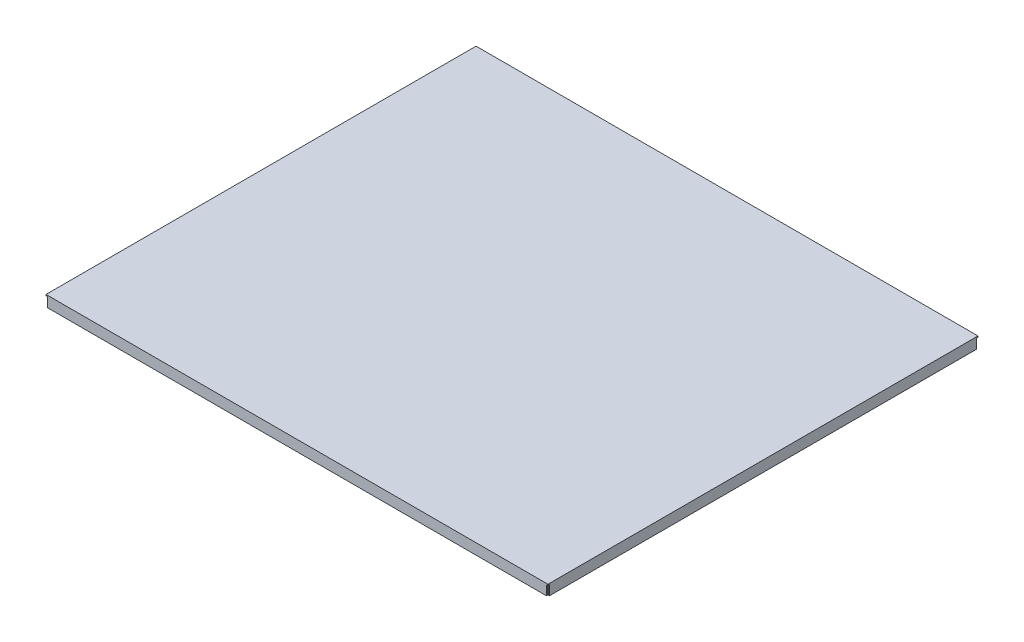
ISO-10303-21;
HEADER;
FILE_DESCRIPTION(('STEP AP214'),'2;1');
FILE_NAME('part.step','',(''),(''),'','','');
FILE_SCHEMA(('AUTOMOTIVE_DESIGN { 1 0 10303 214 1 1 1 1 }'));
ENDSEC;
DATA;
#1=APPLICATION_CONTEXT('core data for automotive mechanical design processes');
#2=APPLICATION_PROTOCOL_DEFINITION('international standard','automotive_design',2000,#1);
#3=PRODUCT_CONTEXT('',#1,'mechanical');
#4=PRODUCT('Part','Part','',(#3));
#5=PRODUCT_RELATED_PRODUCT_CATEGORY('part','',(#4));
#6=PRODUCT_DEFINITION_FORMATION('','',#4);
#7=PRODUCT_DEFINITION_CONTEXT('part definition',#1,'design');
#8=PRODUCT_DEFINITION('design','',#6,#7);
#9=PRODUCT_DEFINITION_SHAPE('','',#8);
#10=(LENGTH_UNIT() NAMED_UNIT(*) SI_UNIT(.MILLI.,.METRE.));
#11=(NAMED_UNIT(*) PLANE_ANGLE_UNIT() SI_UNIT($,.RADIAN.));
#12=(NAMED_UNIT(*) SI_UNIT($,.STERADIAN.) SOLID_ANGLE_UNIT());
#13=UNCERTAINTY_MEASURE_WITH_UNIT(LENGTH_MEASURE(1.E-05),#10,'distance_accuracy_value','');
#14=(GEOMETRIC_REPRESENTATION_CONTEXT(3) GLOBAL_UNCERTAINTY_ASSIGNED_CONTEXT((#13)) GLOBAL_UNIT_ASSIGNED_CONTEXT((#10,
#11,#12)) REPRESENTATION_CONTEXT('',''));
#15=CARTESIAN_POINT('',(0.,0.,0.));
#16=DIRECTION('',(0.,0.,1.));
#17=DIRECTION('',(1.,0.,0.));
#18=AXIS2_PLACEMENT_3D('',#15,#16,#17);
#19=CARTESIAN_POINT('',(0.,485.,0.));
#20=DIRECTION('',(0.,-1.,0.));
#21=DIRECTION('',(0.,0.,-1.));
#22=AXIS2_PLACEMENT_3D('',#19,#20,#21);
#23=PLANE('',#22);
#24=DIRECTION('',(-1.,0.,0.));
#25=VECTOR('',#24,1.);
#26=CARTESIAN_POINT('',(-349.,485.,53.));
#27=LINE('',#26,#25);
#28=CARTESIAN_POINT('',(-347.5,485.,53.));
#29=VERTEX_POINT('',#28);
#30=CARTESIAN_POINT('',(-349.,485.,53.));
#31=VERTEX_POINT('',#30);
#32=EDGE_CURVE('E167',#29,#31,#27,.T.);
#33=ORIENTED_EDGE('',*,*,#32,.F.);
#34=DIRECTION('',(0.,0.,-1.));
#35=VECTOR('',#34,1.);
#36=CARTESIAN_POINT('',(-347.5,485.,647.5));
#37=LINE('',#36,#35);
#38=CARTESIAN_POINT('',(-347.5,485.,647.));
#39=VERTEX_POINT('',#38);
#40=EDGE_CURVE('E271',#39,#29,#37,.T.);
#41=ORIENTED_EDGE('',*,*,#40,.F.);
#42=DIRECTION('',(1.,0.,0.));
#43=VECTOR('',#42,1.);
#44=CARTESIAN_POINT('',(-349.000000000001,485.,647.));
#45=LINE('',#44,#43);
#46=CARTESIAN_POINT('',(-349.000000000001,485.,647.));
#47=VERTEX_POINT('',#46);
#48=EDGE_CURVE('E244',#47,#39,#45,.T.);
#49=ORIENTED_EDGE('',*,*,#48,.F.);
#50=DIRECTION('',(0.,0.,1.));
#51=VECTOR('',#50,1.);
#52=CARTESIAN_POINT('',(-349.,485.,649.));
#53=LINE('',#52,#51);
#54=EDGE_CURVE('E203',#31,#47,#53,.T.);
#55=ORIENTED_EDGE('',*,*,#54,.F.);
#56=EDGE_LOOP('',(#33,#41,#49,#55));
#57=FACE_BOUND('',#56,.T.);
#58=ADVANCED_FACE('F17',(#57),#23,.T.);
#59=DIRECTION('',(1.,0.,0.));
#60=VECTOR('',#59,1.);
#61=CARTESIAN_POINT('',(349.,485.,647.000000000001));
#62=LINE('',#61,#60);
#63=CARTESIAN_POINT('',(347.500000000001,485.,647.000000000001));
#64=VERTEX_POINT('',#63);
#65=CARTESIAN_POINT('',(349.,485.,647.000000000001));
#66=VERTEX_POINT('',#65);
#67=EDGE_CURVE('E287',#64,#66,#62,.T.);
#68=ORIENTED_EDGE('',*,*,#67,.F.);
#69=DIRECTION('',(0.,0.,1.));
#70=VECTOR('',#69,1.);
#71=CARTESIAN_POINT('',(347.5,485.,52.5));
#72=LINE('',#71,#70);
#73=CARTESIAN_POINT('',(347.5,485.,52.9999999999999));
#74=VERTEX_POINT('',#73);
#75=EDGE_CURVE('E264',#74,#64,#72,.T.);
#76=ORIENTED_EDGE('',*,*,#75,.F.);
#77=DIRECTION('',(-1.,0.,0.));
#78=VECTOR('',#77,1.);
#79=CARTESIAN_POINT('',(349.,485.,52.9999999999999));
#80=LINE('',#79,#78);
#81=CARTESIAN_POINT('',(349.,485.,52.9999999999999));
#82=VERTEX_POINT('',#81);
#83=EDGE_CURVE('E307',#82,#74,#80,.T.);
#84=ORIENTED_EDGE('',*,*,#83,.F.);
#85=DIRECTION('',(0.,0.,-1.));
#86=VECTOR('',#85,1.);
#87=CARTESIAN_POINT('',(349.000000000001,485.,649.));
#88=LINE('',#87,#86);
#89=EDGE_CURVE('E184',#66,#82,#88,.T.);
#90=ORIENTED_EDGE('',*,*,#89,.F.);
#91=EDGE_LOOP('',(#68,#76,#84,#90));
#92=FACE_BOUND('',#91,.T.);
#93=ADVANCED_FACE('F357',(#92),#23,.T.);
#94=DIRECTION('',(-1.11022302462509E-13,0.,1.));
#95=VECTOR('',#94,1.);
#96=CARTESIAN_POINT('',(-347.,485.,50.9999999999999));
#97=LINE('',#96,#95);
#98=CARTESIAN_POINT('',(-347.,485.,50.9999999999999));
#99=VERTEX_POINT('',#98);
#100=CARTESIAN_POINT('',(-347.,485.,52.5000000000001));
#101=VERTEX_POINT('',#100);
#102=EDGE_CURVE('E160',#99,#101,#97,.T.);
#103=ORIENTED_EDGE('',*,*,#102,.F.);
#104=DIRECTION('',(-1.,0.,0.));
#105=VECTOR('',#104,1.);
#106=CARTESIAN_POINT('',(-349.,485.,51.));
#107=LINE('',#106,#105);
#108=CARTESIAN_POINT('',(347.,485.,50.9999999999998));
#109=VERTEX_POINT('',#108);
#110=EDGE_CURVE('E174',#109,#99,#107,.T.);
#111=ORIENTED_EDGE('',*,*,#110,.F.);
#112=DIRECTION('',(-1.11022302462509E-13,0.,-1.));
#113=VECTOR('',#112,1.);
#114=CARTESIAN_POINT('',(347.,485.,50.9999999999998));
#115=LINE('',#114,#113);
#116=CARTESIAN_POINT('',(347.,485.,52.5));
#117=VERTEX_POINT('',#116);
#118=EDGE_CURVE('E309',#117,#109,#115,.T.);
#119=ORIENTED_EDGE('',*,*,#118,.F.);
#120=DIRECTION('',(1.,0.,0.));
#121=VECTOR('',#120,1.);
#122=CARTESIAN_POINT('',(-347.5,485.,52.5000000000001));
#123=LINE('',#122,#121);
#124=EDGE_CURVE('E176',#101,#117,#123,.T.);
#125=ORIENTED_EDGE('',*,*,#124,.F.);
#126=EDGE_LOOP('',(#103,#111,#119,#125));
#127=FACE_BOUND('',#126,.T.);
#128=ADVANCED_FACE('F172',(#127),#23,.T.);
#129=CARTESIAN_POINT('',(-349.,485.,649.));
#130=DIRECTION('',(-1.,0.,0.));
#131=DIRECTION('',(0.,0.,1.));
#132=AXIS2_PLACEMENT_3D('',#129,#130,#131);
#133=PLANE('',#132);
#134=DIRECTION('',(0.,-1.,0.));
#135=VECTOR('',#134,1.);
#136=CARTESIAN_POINT('',(-349.,501.328427124747,53.));
#137=LINE('',#136,#135);
#138=CARTESIAN_POINT('',(-349.,498.5,53.));
#139=VERTEX_POINT('',#138);
#140=EDGE_CURVE('E166',#139,#31,#137,.T.);
#141=ORIENTED_EDGE('',*,*,#140,.T.);
#142=ORIENTED_EDGE('',*,*,#54,.T.);
#143=DIRECTION('',(0.,-1.,0.));
#144=VECTOR('',#143,1.);
#145=CARTESIAN_POINT('',(-349.000000000001,501.328427124747,647.));
#146=LINE('',#145,#144);
#147=CARTESIAN_POINT('',(-349.000000000001,498.5,647.));
#148=VERTEX_POINT('',#147);
#149=EDGE_CURVE('E249',#148,#47,#146,.T.);
#150=ORIENTED_EDGE('',*,*,#149,.F.);
#151=DIRECTION('',(2.22044604925043E-13,0.,1.));
#152=VECTOR('',#151,1.);
#153=CARTESIAN_POINT('',(-349.,498.5,649.));
#154=LINE('',#153,#152);
#155=CARTESIAN_POINT('',(-349.,498.5,649.));
#156=VERTEX_POINT('',#155);
#157=EDGE_CURVE('E228',#148,#156,#154,.T.);
#158=ORIENTED_EDGE('',*,*,#157,.T.);
#159=DIRECTION('',(0.,1.,0.));
#160=VECTOR('',#159,1.);
#161=CARTESIAN_POINT('',(-349.,485.,649.));
#162=LINE('',#161,#160);
#163=CARTESIAN_POINT('',(-349.,500.,649.));
#164=VERTEX_POINT('',#163);
#165=EDGE_CURVE('E21',#156,#164,#162,.T.);
#166=ORIENTED_EDGE('',*,*,#165,.T.);
#167=DIRECTION('',(0.,0.,1.));
#168=VECTOR('',#167,1.);
#169=CARTESIAN_POINT('',(-349.,500.,649.));
#170=LINE('',#169,#168);
#171=CARTESIAN_POINT('',(-349.,500.,51.));
#172=VERTEX_POINT('',#171);
#173=EDGE_CURVE('E192',#172,#164,#170,.T.);
#174=ORIENTED_EDGE('',*,*,#173,.F.);
#175=DIRECTION('',(0.,1.,0.));
#176=VECTOR('',#175,1.);
#177=CARTESIAN_POINT('',(-349.,485.,51.));
#178=LINE('',#177,#176);
#179=CARTESIAN_POINT('',(-349.,498.5,51.0000000000001));
#180=VERTEX_POINT('',#179);
#181=EDGE_CURVE('E11',#180,#172,#178,.T.);
#182=ORIENTED_EDGE('',*,*,#181,.F.);
#183=DIRECTION('',(0.,0.,1.));
#184=VECTOR('',#183,1.);
#185=CARTESIAN_POINT('',(-349.,498.5,51.0000000000001));
#186=LINE('',#185,#184);
#187=EDGE_CURVE('E345',#180,#139,#186,.T.);
#188=ORIENTED_EDGE('',*,*,#187,.T.);
#189=EDGE_LOOP('',(#141,#142,#150,#158,#166,#174,#182,#188));
#190=FACE_BOUND('',#189,.T.);
#191=ADVANCED_FACE('F19',(#190),#133,.T.);
#192=CARTESIAN_POINT('',(-349.,485.,51.));
#193=DIRECTION('',(0.,0.,-1.));
#194=DIRECTION('',(-1.,0.,0.));
#195=AXIS2_PLACEMENT_3D('',#192,#193,#194);
#196=PLANE('',#195);
#197=DIRECTION('',(0.,-1.,0.));
#198=VECTOR('',#197,1.);
#199=CARTESIAN_POINT('',(-347.,501.328427124747,50.9999999999999));
#200=LINE('',#199,#198);
#201=CARTESIAN_POINT('',(-347.,498.5,50.9999999999999));
#202=VERTEX_POINT('',#201);
#203=EDGE_CURVE('E157',#202,#99,#200,.T.);
#204=ORIENTED_EDGE('',*,*,#203,.F.);
#205=DIRECTION('',(-1.,0.,0.));
#206=VECTOR('',#205,1.);
#207=CARTESIAN_POINT('',(-349.,498.5,51.0000000000001));
#208=LINE('',#207,#206);
#209=EDGE_CURVE('E318',#202,#180,#208,.T.);
#210=ORIENTED_EDGE('',*,*,#209,.T.);
#211=ORIENTED_EDGE('',*,*,#181,.T.);
#212=DIRECTION('',(-1.,0.,0.));
#213=VECTOR('',#212,1.);
#214=CARTESIAN_POINT('',(-349.,500.,51.));
#215=LINE('',#214,#213);
#216=CARTESIAN_POINT('',(349.,500.,50.9999999999999));
#217=VERTEX_POINT('',#216);
#218=EDGE_CURVE('E201',#217,#172,#215,.T.);
#219=ORIENTED_EDGE('',*,*,#218,.F.);
#220=DIRECTION('',(0.,1.,0.));
#221=VECTOR('',#220,1.);
#222=CARTESIAN_POINT('',(349.,485.,50.9999999999999));
#223=LINE('',#222,#221);
#224=CARTESIAN_POINT('',(349.,498.5,50.9999999999999));
#225=VERTEX_POINT('',#224);
#226=EDGE_CURVE('E26',#225,#217,#223,.T.);
#227=ORIENTED_EDGE('',*,*,#226,.F.);
#228=DIRECTION('',(-1.,0.,0.));
#229=VECTOR('',#228,1.);
#230=CARTESIAN_POINT('',(349.,498.5,50.9999999999999));
#231=LINE('',#230,#229);
#232=CARTESIAN_POINT('',(347.,498.5,50.9999999999998));
#233=VERTEX_POINT('',#232);
#234=EDGE_CURVE('E304',#225,#233,#231,.T.);
#235=ORIENTED_EDGE('',*,*,#234,.T.);
#236=DIRECTION('',(0.,-1.,0.));
#237=VECTOR('',#236,1.);
#238=CARTESIAN_POINT('',(347.,501.328427124747,50.9999999999998));
#239=LINE('',#238,#237);
#240=EDGE_CURVE('E183',#233,#109,#239,.T.);
#241=ORIENTED_EDGE('',*,*,#240,.T.);
#242=ORIENTED_EDGE('',*,*,#110,.T.);
#243=EDGE_LOOP('',(#204,#210,#211,#219,#227,#235,#241,#242));
#244=FACE_BOUND('',#243,.T.);
#245=ADVANCED_FACE('F180',(#244),#196,.T.);
#246=CARTESIAN_POINT('',(349.000000000001,485.,649.));
#247=DIRECTION('',(1.,0.,0.));
#248=DIRECTION('',(0.,0.,-1.));
#249=AXIS2_PLACEMENT_3D('',#246,#247,#248);
#250=PLANE('',#249);
#251=DIRECTION('',(0.,-1.,0.));
#252=VECTOR('',#251,1.);
#253=CARTESIAN_POINT('',(349.,501.328427124747,647.000000000001));
#254=LINE('',#253,#252);
#255=CARTESIAN_POINT('',(349.,498.5,647.000000000001));
#256=VERTEX_POINT('',#255);
#257=EDGE_CURVE('E297',#256,#66,#254,.T.);
#258=ORIENTED_EDGE('',*,*,#257,.T.);
#259=ORIENTED_EDGE('',*,*,#89,.T.);
#260=DIRECTION('',(0.,-1.,0.));
#261=VECTOR('',#260,1.);
#262=CARTESIAN_POINT('',(349.,501.328427124747,52.9999999999999));
#263=LINE('',#262,#261);
#264=CARTESIAN_POINT('',(349.,498.5,52.9999999999999));
#265=VERTEX_POINT('',#264);
#266=EDGE_CURVE('E311',#265,#82,#263,.T.);
#267=ORIENTED_EDGE('',*,*,#266,.F.);
#268=DIRECTION('',(1.11022302462516E-13,0.,-1.));
#269=VECTOR('',#268,1.);
#270=CARTESIAN_POINT('',(349.,498.5,50.9999999999999));
#271=LINE('',#270,#269);
#272=EDGE_CURVE('E291',#265,#225,#271,.T.);
#273=ORIENTED_EDGE('',*,*,#272,.T.);
#274=ORIENTED_EDGE('',*,*,#226,.T.);
#275=DIRECTION('',(0.,0.,-1.));
#276=VECTOR('',#275,1.);
#277=CARTESIAN_POINT('',(349.000000000001,500.,649.));
#278=LINE('',#277,#276);
#279=CARTESIAN_POINT('',(349.000000000001,500.,649.));
#280=VERTEX_POINT('',#279);
#281=EDGE_CURVE('E198',#280,#217,#278,.T.);
#282=ORIENTED_EDGE('',*,*,#281,.F.);
#283=DIRECTION('',(0.,1.,0.));
#284=VECTOR('',#283,1.);
#285=CARTESIAN_POINT('',(349.000000000001,485.,649.));
#286=LINE('',#285,#284);
#287=CARTESIAN_POINT('',(349.000000000001,498.5,649.));
#288=VERTEX_POINT('',#287);
#289=EDGE_CURVE('E186',#288,#280,#286,.T.);
#290=ORIENTED_EDGE('',*,*,#289,.F.);
#291=DIRECTION('',(-3.33066907387695E-13,0.,-1.));
#292=VECTOR('',#291,1.);
#293=CARTESIAN_POINT('',(349.000000000001,498.5,649.));
#294=LINE('',#293,#292);
#295=EDGE_CURVE('E294',#288,#256,#294,.T.);
#296=ORIENTED_EDGE('',*,*,#295,.T.);
#297=EDGE_LOOP('',(#258,#259,#267,#273,#274,#282,#290,#296));
#298=FACE_BOUND('',#297,.T.);
#299=ADVANCED_FACE('F217',(#298),#250,.T.);
#300=CARTESIAN_POINT('',(-349.,485.,649.));
#301=DIRECTION('',(0.,0.,1.));
#302=DIRECTION('',(1.,0.,0.));
#303=AXIS2_PLACEMENT_3D('',#300,#301,#302);
#304=PLANE('',#303);
#305=DIRECTION('',(0.,-1.,0.));
#306=VECTOR('',#305,1.);
#307=CARTESIAN_POINT('',(347.,501.328427124747,649.000000000001));
#308=LINE('',#307,#306);
#309=CARTESIAN_POINT('',(347.,498.5,649.000000000001));
#310=VERTEX_POINT('',#309);
#311=CARTESIAN_POINT('',(347.,485.,649.000000000001));
#312=VERTEX_POINT('',#311);
#313=EDGE_CURVE('E278',#310,#312,#308,.T.);
#314=ORIENTED_EDGE('',*,*,#313,.F.);
#315=DIRECTION('',(1.,0.,-4.99600361081154E-13));
#316=VECTOR('',#315,1.);
#317=CARTESIAN_POINT('',(349.000000000001,498.5,649.));
#318=LINE('',#317,#316);
#319=EDGE_CURVE('E177',#310,#288,#318,.T.);
#320=ORIENTED_EDGE('',*,*,#319,.T.);
#321=ORIENTED_EDGE('',*,*,#289,.T.);
#322=DIRECTION('',(1.,0.,0.));
#323=VECTOR('',#322,1.);
#324=CARTESIAN_POINT('',(-349.,500.,649.));
#325=LINE('',#324,#323);
#326=EDGE_CURVE('E195',#164,#280,#325,.T.);
#327=ORIENTED_EDGE('',*,*,#326,.F.);
#328=ORIENTED_EDGE('',*,*,#165,.F.);
#329=DIRECTION('',(1.,0.,1.11022302462537E-13));
#330=VECTOR('',#329,1.);
#331=CARTESIAN_POINT('',(-349.,498.5,649.));
#332=LINE('',#331,#330);
#333=CARTESIAN_POINT('',(-347.,498.5,649.));
#334=VERTEX_POINT('',#333);
#335=EDGE_CURVE('E231',#156,#334,#332,.T.);
#336=ORIENTED_EDGE('',*,*,#335,.T.);
#337=DIRECTION('',(0.,-1.,0.));
#338=VECTOR('',#337,1.);
#339=CARTESIAN_POINT('',(-347.,501.328427124747,649.));
#340=LINE('',#339,#338);
#341=CARTESIAN_POINT('',(-347.,485.,649.));
#342=VERTEX_POINT('',#341);
#343=EDGE_CURVE('E234',#334,#342,#340,.T.);
#344=ORIENTED_EDGE('',*,*,#343,.T.);
#345=DIRECTION('',(1.,0.,0.));
#346=VECTOR('',#345,1.);
#347=CARTESIAN_POINT('',(-349.,485.,649.));
#348=LINE('',#347,#346);
#349=EDGE_CURVE('E188',#342,#312,#348,.T.);
#350=ORIENTED_EDGE('',*,*,#349,.T.);
#351=EDGE_LOOP('',(#314,#320,#321,#327,#328,#336,#344,#350));
#352=FACE_BOUND('',#351,.T.);
#353=ADVANCED_FACE('F211',(#352),#304,.T.);
#354=DIRECTION('',(1.11022302462509E-13,0.,-1.));
#355=VECTOR('',#354,1.);
#356=CARTESIAN_POINT('',(347.,485.,649.000000000001));
#357=LINE('',#356,#355);
#358=CARTESIAN_POINT('',(347.,485.,647.5));
#359=VERTEX_POINT('',#358);
#360=EDGE_CURVE('E284',#312,#359,#357,.T.);
#361=ORIENTED_EDGE('',*,*,#360,.F.);
#362=ORIENTED_EDGE('',*,*,#349,.F.);
#363=DIRECTION('',(1.11022302462509E-13,0.,1.));
#364=VECTOR('',#363,1.);
#365=CARTESIAN_POINT('',(-347.,485.,649.));
#366=LINE('',#365,#364);
#367=CARTESIAN_POINT('',(-347.000000000001,485.,647.5));
#368=VERTEX_POINT('',#367);
#369=EDGE_CURVE('E246',#368,#342,#366,.T.);
#370=ORIENTED_EDGE('',*,*,#369,.F.);
#371=DIRECTION('',(-1.,0.,0.));
#372=VECTOR('',#371,1.);
#373=CARTESIAN_POINT('',(347.500000000001,485.,647.5));
#374=LINE('',#373,#372);
#375=EDGE_CURVE('E259',#359,#368,#374,.T.);
#376=ORIENTED_EDGE('',*,*,#375,.F.);
#377=EDGE_LOOP('',(#361,#362,#370,#376));
#378=FACE_BOUND('',#377,.T.);
#379=ADVANCED_FACE('F282',(#378),#23,.T.);
#380=CARTESIAN_POINT('',(0.,500.,0.));
#381=DIRECTION('',(0.,-1.,0.));
#382=DIRECTION('',(0.,0.,-1.));
#383=AXIS2_PLACEMENT_3D('',#380,#381,#382);
#384=PLANE('',#383);
#385=ORIENTED_EDGE('',*,*,#173,.T.);
#386=ORIENTED_EDGE('',*,*,#326,.T.);
#387=ORIENTED_EDGE('',*,*,#281,.T.);
#388=ORIENTED_EDGE('',*,*,#218,.T.);
#389=EDGE_LOOP('',(#385,#386,#387,#388));
#390=FACE_BOUND('',#389,.T.);
#391=ADVANCED_FACE('F221',(#390),#384,.F.);
#392=CARTESIAN_POINT('',(347.500000000001,1414.90436658702,647.5));
#393=DIRECTION('',(0.,0.,1.));
#394=DIRECTION('',(1.,0.,0.));
#395=AXIS2_PLACEMENT_3D('',#392,#393,#394);
#396=PLANE('',#395);
#397=DIRECTION('',(1.,0.,0.));
#398=VECTOR('',#397,1.);
#399=CARTESIAN_POINT('',(347.500000000001,498.5,647.5));
#400=LINE('',#399,#398);
#401=CARTESIAN_POINT('',(-347.000000000001,498.5,647.5));
#402=VERTEX_POINT('',#401);
#403=CARTESIAN_POINT('',(347.,498.5,647.5));
#404=VERTEX_POINT('',#403);
#405=EDGE_CURVE('E267',#402,#404,#400,.T.);
#406=ORIENTED_EDGE('',*,*,#405,.T.);
#407=DIRECTION('',(0.,-1.,0.));
#408=VECTOR('',#407,1.);
#409=CARTESIAN_POINT('',(347.,1414.90436658702,647.5));
#410=LINE('',#409,#408);
#411=EDGE_CURVE('E321',#404,#359,#410,.T.);
#412=ORIENTED_EDGE('',*,*,#411,.T.);
#413=ORIENTED_EDGE('',*,*,#375,.T.);
#414=DIRECTION('',(0.,1.,0.));
#415=VECTOR('',#414,1.);
#416=CARTESIAN_POINT('',(-347.000000000001,1414.90436658702,647.5));
#417=LINE('',#416,#415);
#418=EDGE_CURVE('E256',#368,#402,#417,.T.);
#419=ORIENTED_EDGE('',*,*,#418,.T.);
#420=EDGE_LOOP('',(#406,#412,#413,#419));
#421=FACE_BOUND('',#420,.T.);
#422=ADVANCED_FACE('F395',(#421),#396,.F.);
#423=CARTESIAN_POINT('',(347.5,1414.90436658702,52.5));
#424=DIRECTION('',(1.,0.,0.));
#425=DIRECTION('',(0.,0.,-1.));
#426=AXIS2_PLACEMENT_3D('',#423,#424,#425);
#427=PLANE('',#426);
#428=ORIENTED_EDGE('',*,*,#75,.T.);
#429=DIRECTION('',(0.,1.,0.));
#430=VECTOR('',#429,1.);
#431=CARTESIAN_POINT('',(347.500000000001,1414.90436658702,647.000000000001));
#432=LINE('',#431,#430);
#433=CARTESIAN_POINT('',(347.500000000001,498.5,647.000000000001));
#434=VERTEX_POINT('',#433);
#435=EDGE_CURVE('E323',#64,#434,#432,.T.);
#436=ORIENTED_EDGE('',*,*,#435,.T.);
#437=DIRECTION('',(0.,0.,-1.));
#438=VECTOR('',#437,1.);
#439=CARTESIAN_POINT('',(347.5,498.5,52.5));
#440=LINE('',#439,#438);
#441=CARTESIAN_POINT('',(347.500000000001,498.5,52.9999999999999));
#442=VERTEX_POINT('',#441);
#443=EDGE_CURVE('E263',#434,#442,#440,.T.);
#444=ORIENTED_EDGE('',*,*,#443,.T.);
#445=DIRECTION('',(0.,-1.,0.));
#446=VECTOR('',#445,1.);
#447=CARTESIAN_POINT('',(347.5,1414.90436658702,53.));
#448=LINE('',#447,#446);
#449=EDGE_CURVE('E314',#442,#74,#448,.T.);
#450=ORIENTED_EDGE('',*,*,#449,.T.);
#451=EDGE_LOOP('',(#428,#436,#444,#450));
#452=FACE_BOUND('',#451,.T.);
#453=ADVANCED_FACE('F360',(#452),#427,.F.);
#454=CARTESIAN_POINT('',(-347.5,1414.90436658702,52.5000000000001));
#455=DIRECTION('',(0.,0.,-1.));
#456=DIRECTION('',(-1.,0.,0.));
#457=AXIS2_PLACEMENT_3D('',#454,#455,#456);
#458=PLANE('',#457);
#459=DIRECTION('',(-1.,0.,0.));
#460=VECTOR('',#459,1.);
#461=CARTESIAN_POINT('',(-347.5,498.5,52.5000000000001));
#462=LINE('',#461,#460);
#463=CARTESIAN_POINT('',(347.,498.5,52.5));
#464=VERTEX_POINT('',#463);
#465=CARTESIAN_POINT('',(-347.,498.5,52.5));
#466=VERTEX_POINT('',#465);
#467=EDGE_CURVE('E260',#464,#466,#462,.T.);
#468=ORIENTED_EDGE('',*,*,#467,.T.);
#469=DIRECTION('',(0.,-1.,0.));
#470=VECTOR('',#469,1.);
#471=CARTESIAN_POINT('',(-347.,1414.90436658702,52.5000000000001));
#472=LINE('',#471,#470);
#473=EDGE_CURVE('E326',#466,#101,#472,.T.);
#474=ORIENTED_EDGE('',*,*,#473,.T.);
#475=ORIENTED_EDGE('',*,*,#124,.T.);
#476=DIRECTION('',(0.,1.,0.));
#477=VECTOR('',#476,1.);
#478=CARTESIAN_POINT('',(347.,1414.90436658702,52.5));
#479=LINE('',#478,#477);
#480=EDGE_CURVE('E317',#117,#464,#479,.T.);
#481=ORIENTED_EDGE('',*,*,#480,.T.);
#482=EDGE_LOOP('',(#468,#474,#475,#481));
#483=FACE_BOUND('',#482,.T.);
#484=ADVANCED_FACE('F369',(#483),#458,.F.);
#485=CARTESIAN_POINT('',(-347.5,1414.90436658702,647.5));
#486=DIRECTION('',(-1.,0.,0.));
#487=DIRECTION('',(0.,0.,1.));
#488=AXIS2_PLACEMENT_3D('',#485,#486,#487);
#489=PLANE('',#488);
#490=ORIENTED_EDGE('',*,*,#40,.T.);
#491=DIRECTION('',(0.,1.,0.));
#492=VECTOR('',#491,1.);
#493=CARTESIAN_POINT('',(-347.5,1414.90436658702,53.0000000000002));
#494=LINE('',#493,#492);
#495=CARTESIAN_POINT('',(-347.5,498.5,53.));
#496=VERTEX_POINT('',#495);
#497=EDGE_CURVE('E247',#29,#496,#494,.T.);
#498=ORIENTED_EDGE('',*,*,#497,.T.);
#499=DIRECTION('',(0.,0.,1.));
#500=VECTOR('',#499,1.);
#501=CARTESIAN_POINT('',(-347.5,498.5,647.5));
#502=LINE('',#501,#500);
#503=CARTESIAN_POINT('',(-347.5,498.5,647.));
#504=VERTEX_POINT('',#503);
#505=EDGE_CURVE('E34',#496,#504,#502,.T.);
#506=ORIENTED_EDGE('',*,*,#505,.T.);
#507=DIRECTION('',(0.,-1.,0.));
#508=VECTOR('',#507,1.);
#509=CARTESIAN_POINT('',(-347.5,1414.90436658702,647.));
#510=LINE('',#509,#508);
#511=EDGE_CURVE('E254',#504,#39,#510,.T.);
#512=ORIENTED_EDGE('',*,*,#511,.T.);
#513=EDGE_LOOP('',(#490,#498,#506,#512));
#514=FACE_BOUND('',#513,.T.);
#515=ADVANCED_FACE('F327',(#514),#489,.F.);
#516=CARTESIAN_POINT('',(0.,498.5,0.));
#517=DIRECTION('',(0.,-1.,0.));
#518=DIRECTION('',(0.,0.,-1.));
#519=AXIS2_PLACEMENT_3D('',#516,#517,#518);
#520=PLANE('',#519);
#521=ORIENTED_EDGE('',*,*,#505,.F.);
#522=DIRECTION('',(1.,0.,0.));
#523=VECTOR('',#522,1.);
#524=CARTESIAN_POINT('',(-349.,498.5,53.));
#525=LINE('',#524,#523);
#526=EDGE_CURVE('E332',#139,#496,#525,.T.);
#527=ORIENTED_EDGE('',*,*,#526,.F.);
#528=ORIENTED_EDGE('',*,*,#187,.F.);
#529=ORIENTED_EDGE('',*,*,#209,.F.);
#530=DIRECTION('',(1.11022302462509E-13,0.,-1.));
#531=VECTOR('',#530,1.);
#532=CARTESIAN_POINT('',(-347.,498.5,50.9999999999999));
#533=LINE('',#532,#531);
#534=EDGE_CURVE('E163',#466,#202,#533,.T.);
#535=ORIENTED_EDGE('',*,*,#534,.F.);
#536=ORIENTED_EDGE('',*,*,#467,.F.);
#537=DIRECTION('',(1.11022302462509E-13,0.,1.));
#538=VECTOR('',#537,1.);
#539=CARTESIAN_POINT('',(347.,498.5,50.9999999999998));
#540=LINE('',#539,#538);
#541=EDGE_CURVE('E302',#233,#464,#540,.T.);
#542=ORIENTED_EDGE('',*,*,#541,.F.);
#543=ORIENTED_EDGE('',*,*,#234,.F.);
#544=ORIENTED_EDGE('',*,*,#272,.F.);
#545=DIRECTION('',(1.,0.,0.));
#546=VECTOR('',#545,1.);
#547=CARTESIAN_POINT('',(349.,498.5,52.9999999999999));
#548=LINE('',#547,#546);
#549=EDGE_CURVE('E288',#442,#265,#548,.T.);
#550=ORIENTED_EDGE('',*,*,#549,.F.);
#551=ORIENTED_EDGE('',*,*,#443,.F.);
#552=DIRECTION('',(-1.,0.,0.));
#553=VECTOR('',#552,1.);
#554=CARTESIAN_POINT('',(349.,498.5,647.000000000001));
#555=LINE('',#554,#553);
#556=EDGE_CURVE('E346',#256,#434,#555,.T.);
#557=ORIENTED_EDGE('',*,*,#556,.F.);
#558=ORIENTED_EDGE('',*,*,#295,.F.);
#559=ORIENTED_EDGE('',*,*,#319,.F.);
#560=DIRECTION('',(-1.11022302462509E-13,0.,1.));
#561=VECTOR('',#560,1.);
#562=CARTESIAN_POINT('',(347.,498.5,649.000000000001));
#563=LINE('',#562,#561);
#564=EDGE_CURVE('E299',#404,#310,#563,.T.);
#565=ORIENTED_EDGE('',*,*,#564,.F.);
#566=ORIENTED_EDGE('',*,*,#405,.F.);
#567=DIRECTION('',(-1.11022302462509E-13,0.,-1.));
#568=VECTOR('',#567,1.);
#569=CARTESIAN_POINT('',(-347.,498.5,649.));
#570=LINE('',#569,#568);
#571=EDGE_CURVE('E237',#334,#402,#570,.T.);
#572=ORIENTED_EDGE('',*,*,#571,.F.);
#573=ORIENTED_EDGE('',*,*,#335,.F.);
#574=ORIENTED_EDGE('',*,*,#157,.F.);
#575=DIRECTION('',(-1.,0.,0.));
#576=VECTOR('',#575,1.);
#577=CARTESIAN_POINT('',(-349.000000000001,498.5,647.));
#578=LINE('',#577,#576);
#579=EDGE_CURVE('E239',#504,#148,#578,.T.);
#580=ORIENTED_EDGE('',*,*,#579,.F.);
#581=EDGE_LOOP('',(#521,#527,#528,#529,#535,#536,#542,#543,#544,#550,#551,#557,#558,#559,#565,
#566,#572,#573,#574,#580));
#582=FACE_BOUND('',#581,.T.);
#583=ADVANCED_FACE('F331',(#582),#520,.T.);
#584=CARTESIAN_POINT('',(-347.,501.328427124747,649.));
#585=DIRECTION('',(1.,0.,-1.11022302462509E-13));
#586=DIRECTION('',(-1.11022302462509E-13,0.,-1.));
#587=AXIS2_PLACEMENT_3D('',#584,#585,#586);
#588=PLANE('',#587);
#589=ORIENTED_EDGE('',*,*,#369,.T.);
#590=ORIENTED_EDGE('',*,*,#343,.F.);
#591=ORIENTED_EDGE('',*,*,#571,.T.);
#592=ORIENTED_EDGE('',*,*,#418,.F.);
#593=EDGE_LOOP('',(#589,#590,#591,#592));
#594=FACE_BOUND('',#593,.T.);
#595=ADVANCED_FACE('F381',(#594),#588,.F.);
#596=CARTESIAN_POINT('',(-349.000000000001,501.328427124747,647.));
#597=DIRECTION('',(0.,0.,-1.));
#598=DIRECTION('',(0.,1.,0.));
#599=AXIS2_PLACEMENT_3D('',#596,#597,#598);
#600=PLANE('',#599);
#601=ORIENTED_EDGE('',*,*,#579,.T.);
#602=ORIENTED_EDGE('',*,*,#149,.T.);
#603=ORIENTED_EDGE('',*,*,#48,.T.);
#604=ORIENTED_EDGE('',*,*,#511,.F.);
#605=EDGE_LOOP('',(#601,#602,#603,#604));
#606=FACE_BOUND('',#605,.T.);
#607=ADVANCED_FACE('F336',(#606),#600,.F.);
#608=CARTESIAN_POINT('',(-349.,501.328427124747,53.));
#609=DIRECTION('',(0.,0.,1.));
#610=DIRECTION('',(0.,-1.,0.));
#611=AXIS2_PLACEMENT_3D('',#608,#609,#610);
#612=PLANE('',#611);
#613=ORIENTED_EDGE('',*,*,#32,.T.);
#614=ORIENTED_EDGE('',*,*,#140,.F.);
#615=ORIENTED_EDGE('',*,*,#526,.T.);
#616=ORIENTED_EDGE('',*,*,#497,.F.);
#617=EDGE_LOOP('',(#613,#614,#615,#616));
#618=FACE_BOUND('',#617,.T.);
#619=ADVANCED_FACE('F372',(#618),#612,.F.);
#620=CARTESIAN_POINT('',(-347.,501.328427124747,50.9999999999999));
#621=DIRECTION('',(1.,0.,1.11022302462509E-13));
#622=DIRECTION('',(1.11022302462509E-13,0.,-1.));
#623=AXIS2_PLACEMENT_3D('',#620,#621,#622);
#624=PLANE('',#623);
#625=ORIENTED_EDGE('',*,*,#534,.T.);
#626=ORIENTED_EDGE('',*,*,#203,.T.);
#627=ORIENTED_EDGE('',*,*,#102,.T.);
#628=ORIENTED_EDGE('',*,*,#473,.F.);
#629=EDGE_LOOP('',(#625,#626,#627,#628));
#630=FACE_BOUND('',#629,.T.);
#631=ADVANCED_FACE('F159',(#630),#624,.F.);
#632=CARTESIAN_POINT('',(347.,501.328427124747,50.9999999999998));
#633=DIRECTION('',(-1.,0.,1.11022302462509E-13));
#634=DIRECTION('',(1.11022302462509E-13,0.,1.));
#635=AXIS2_PLACEMENT_3D('',#632,#633,#634);
#636=PLANE('',#635);
#637=ORIENTED_EDGE('',*,*,#118,.T.);
#638=ORIENTED_EDGE('',*,*,#240,.F.);
#639=ORIENTED_EDGE('',*,*,#541,.T.);
#640=ORIENTED_EDGE('',*,*,#480,.F.);
#641=EDGE_LOOP('',(#637,#638,#639,#640));
#642=FACE_BOUND('',#641,.T.);
#643=ADVANCED_FACE('F367',(#642),#636,.F.);
#644=CARTESIAN_POINT('',(349.,501.328427124747,52.9999999999999));
#645=DIRECTION('',(0.,0.,1.));
#646=DIRECTION('',(0.,-1.,0.));
#647=AXIS2_PLACEMENT_3D('',#644,#645,#646);
#648=PLANE('',#647);
#649=ORIENTED_EDGE('',*,*,#549,.T.);
#650=ORIENTED_EDGE('',*,*,#266,.T.);
#651=ORIENTED_EDGE('',*,*,#83,.T.);
#652=ORIENTED_EDGE('',*,*,#449,.F.);
#653=EDGE_LOOP('',(#649,#650,#651,#652));
#654=FACE_BOUND('',#653,.T.);
#655=ADVANCED_FACE('F362',(#654),#648,.F.);
#656=CARTESIAN_POINT('',(349.,501.328427124747,647.000000000001));
#657=DIRECTION('',(0.,0.,-1.));
#658=DIRECTION('',(0.,1.,0.));
#659=AXIS2_PLACEMENT_3D('',#656,#657,#658);
#660=PLANE('',#659);
#661=ORIENTED_EDGE('',*,*,#67,.T.);
#662=ORIENTED_EDGE('',*,*,#257,.F.);
#663=ORIENTED_EDGE('',*,*,#556,.T.);
#664=ORIENTED_EDGE('',*,*,#435,.F.);
#665=EDGE_LOOP('',(#661,#662,#663,#664));
#666=FACE_BOUND('',#665,.T.);
#667=ADVANCED_FACE('F353',(#666),#660,.F.);
#668=CARTESIAN_POINT('',(347.,501.328427124747,649.000000000001));
#669=DIRECTION('',(-1.,0.,-1.11022302462509E-13));
#670=DIRECTION('',(-1.11022302462509E-13,0.,1.));
#671=AXIS2_PLACEMENT_3D('',#668,#669,#670);
#672=PLANE('',#671);
#673=ORIENTED_EDGE('',*,*,#564,.T.);
#674=ORIENTED_EDGE('',*,*,#313,.T.);
#675=ORIENTED_EDGE('',*,*,#360,.T.);
#676=ORIENTED_EDGE('',*,*,#411,.F.);
#677=EDGE_LOOP('',(#673,#674,#675,#676));
#678=FACE_BOUND('',#677,.T.);
#679=ADVANCED_FACE('F525',(#678),#672,.F.);
#680=CLOSED_SHELL('',(#58,#93,#128,#191,#245,#299,#353,#379,#391,#422,#453,#484,#515,#583,#595,
#607,#619,#631,#643,#655,#667,#679));
#681=MANIFOLD_SOLID_BREP('B1',#680);
#682=ADVANCED_BREP_SHAPE_REPRESENTATION('',(#18,#681),#14);
#683=SHAPE_DEFINITION_REPRESENTATION(#9,#682);
ENDSEC;
END-ISO-10303-21;
